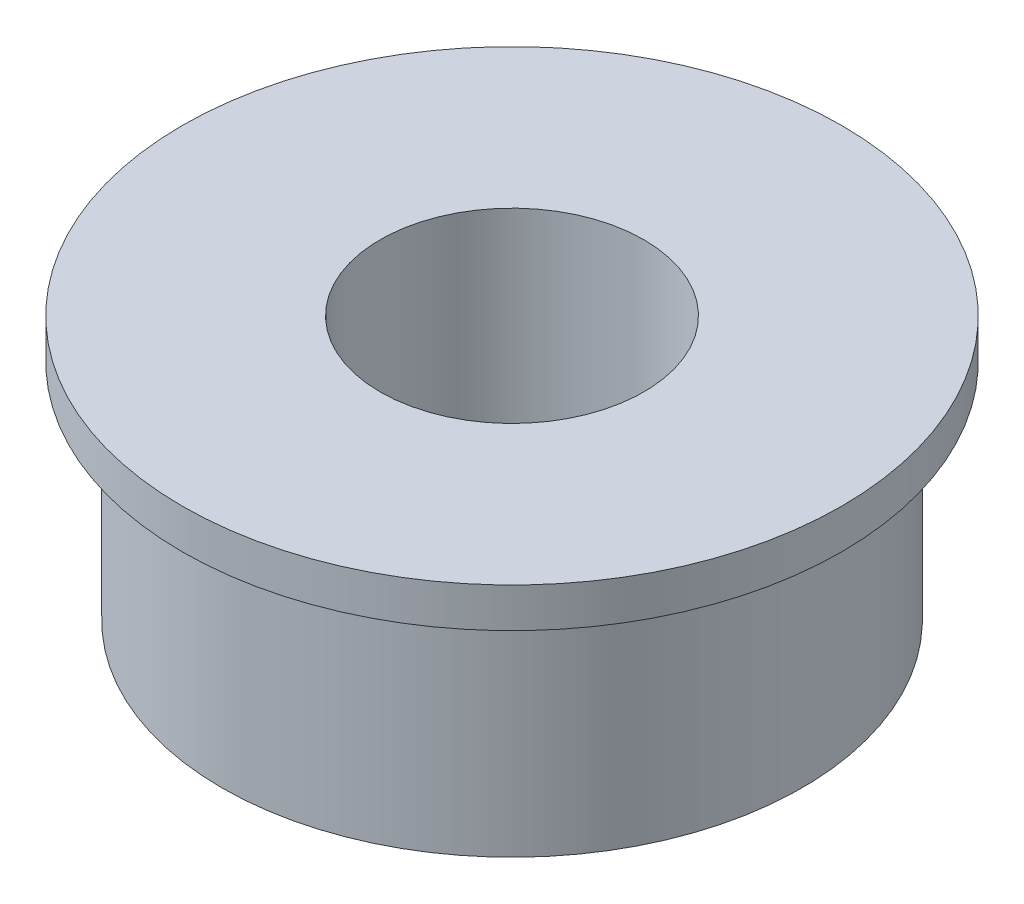
ISO-10303-21;
HEADER;
FILE_DESCRIPTION(('STEP AP214'),'2;1');
FILE_NAME('part.step','',(''),(''),'','','');
FILE_SCHEMA(('AUTOMOTIVE_DESIGN { 1 0 10303 214 1 1 1 1 }'));
ENDSEC;
DATA;
#1=APPLICATION_CONTEXT('core data for automotive mechanical design processes');
#2=APPLICATION_PROTOCOL_DEFINITION('international standard','automotive_design',2000,#1);
#3=PRODUCT_CONTEXT('',#1,'mechanical');
#4=PRODUCT('Part','Part','',(#3));
#5=PRODUCT_RELATED_PRODUCT_CATEGORY('part','',(#4));
#6=PRODUCT_DEFINITION_FORMATION('','',#4);
#7=PRODUCT_DEFINITION_CONTEXT('part definition',#1,'design');
#8=PRODUCT_DEFINITION('design','',#6,#7);
#9=PRODUCT_DEFINITION_SHAPE('','',#8);
#10=(LENGTH_UNIT() NAMED_UNIT(*) SI_UNIT(.MILLI.,.METRE.));
#11=(NAMED_UNIT(*) PLANE_ANGLE_UNIT() SI_UNIT($,.RADIAN.));
#12=(NAMED_UNIT(*) SI_UNIT($,.STERADIAN.) SOLID_ANGLE_UNIT());
#13=UNCERTAINTY_MEASURE_WITH_UNIT(LENGTH_MEASURE(1.E-05),#10,'distance_accuracy_value','');
#14=(GEOMETRIC_REPRESENTATION_CONTEXT(3) GLOBAL_UNCERTAINTY_ASSIGNED_CONTEXT((#13)) GLOBAL_UNIT_ASSIGNED_CONTEXT((#10,
#11,#12)) REPRESENTATION_CONTEXT('',''));
#15=CARTESIAN_POINT('',(0.,0.,0.));
#16=DIRECTION('',(0.,0.,1.));
#17=DIRECTION('',(1.,0.,0.));
#18=AXIS2_PLACEMENT_3D('',#15,#16,#17);
#19=CARTESIAN_POINT('',(0.,5.75520833333333,0.));
#20=DIRECTION('',(0.,1.,0.));
#21=DIRECTION('',(0.,0.,1.));
#22=AXIS2_PLACEMENT_3D('',#19,#20,#21);
#23=CYLINDRICAL_SURFACE('',#22,2.5);
#24=CARTESIAN_POINT('',(0.,5.,0.));
#25=DIRECTION('',(0.,1.,0.));
#26=DIRECTION('',(0.,0.,1.));
#27=AXIS2_PLACEMENT_3D('',#24,#25,#26);
#28=CIRCLE('',#27,2.5);
#29=CARTESIAN_POINT('',(0.,5.,2.5));
#30=VERTEX_POINT('',#29);
#31=EDGE_CURVE('E57',#30,#30,#28,.T.);
#32=ORIENTED_EDGE('',*,*,#31,.T.);
#33=EDGE_LOOP('',(#32));
#34=FACE_BOUND('',#33,.T.);
#35=CARTESIAN_POINT('',(0.,0.,0.));
#36=DIRECTION('',(0.,1.,0.));
#37=DIRECTION('',(0.,0.,1.));
#38=AXIS2_PLACEMENT_3D('',#35,#36,#37);
#39=CIRCLE('',#38,2.5);
#40=CARTESIAN_POINT('',(0.,0.,2.5));
#41=VERTEX_POINT('',#40);
#42=EDGE_CURVE('E10',#41,#41,#39,.T.);
#43=ORIENTED_EDGE('',*,*,#42,.F.);
#44=EDGE_LOOP('',(#43));
#45=FACE_BOUND('',#44,.T.);
#46=ADVANCED_FACE('F35',(#34,#45),#23,.F.);
#47=CARTESIAN_POINT('',(-2.5,0.,0.));
#48=DIRECTION('',(0.,-1.,0.));
#49=DIRECTION('',(0.,0.,-1.));
#50=AXIS2_PLACEMENT_3D('',#47,#48,#49);
#51=PLANE('',#50);
#52=ORIENTED_EDGE('',*,*,#42,.T.);
#53=EDGE_LOOP('',(#52));
#54=FACE_BOUND('',#53,.T.);
#55=CARTESIAN_POINT('',(0.,0.,0.));
#56=DIRECTION('',(0.,1.,0.));
#57=DIRECTION('',(0.,0.,1.));
#58=AXIS2_PLACEMENT_3D('',#55,#56,#57);
#59=CIRCLE('',#58,5.5);
#60=CARTESIAN_POINT('',(0.,0.,5.5));
#61=VERTEX_POINT('',#60);
#62=EDGE_CURVE('E41',#61,#61,#59,.T.);
#63=ORIENTED_EDGE('',*,*,#62,.F.);
#64=EDGE_LOOP('',(#63));
#65=FACE_BOUND('',#64,.T.);
#66=ADVANCED_FACE('F75',(#54,#65),#51,.T.);
#67=CARTESIAN_POINT('',(0.,5.75520833333333,0.));
#68=DIRECTION('',(0.,1.,0.));
#69=DIRECTION('',(0.,0.,1.));
#70=AXIS2_PLACEMENT_3D('',#67,#68,#69);
#71=CYLINDRICAL_SURFACE('',#70,5.5);
#72=ORIENTED_EDGE('',*,*,#62,.T.);
#73=EDGE_LOOP('',(#72));
#74=FACE_BOUND('',#73,.T.);
#75=CARTESIAN_POINT('',(0.,4.25,0.));
#76=DIRECTION('',(0.,1.,0.));
#77=DIRECTION('',(0.,0.,1.));
#78=AXIS2_PLACEMENT_3D('',#75,#76,#77);
#79=CIRCLE('',#78,5.5);
#80=CARTESIAN_POINT('',(0.,4.25,5.5));
#81=VERTEX_POINT('',#80);
#82=EDGE_CURVE('E45',#81,#81,#79,.T.);
#83=ORIENTED_EDGE('',*,*,#82,.F.);
#84=EDGE_LOOP('',(#83));
#85=FACE_BOUND('',#84,.T.);
#86=ADVANCED_FACE('F79',(#74,#85),#71,.T.);
#87=CARTESIAN_POINT('',(-5.5,4.25,0.));
#88=DIRECTION('',(0.,-1.,0.));
#89=DIRECTION('',(0.,0.,-1.));
#90=AXIS2_PLACEMENT_3D('',#87,#88,#89);
#91=PLANE('',#90);
#92=ORIENTED_EDGE('',*,*,#82,.T.);
#93=EDGE_LOOP('',(#92));
#94=FACE_BOUND('',#93,.T.);
#95=CARTESIAN_POINT('',(0.,4.25,0.));
#96=DIRECTION('',(0.,1.,0.));
#97=DIRECTION('',(0.,0.,1.));
#98=AXIS2_PLACEMENT_3D('',#95,#96,#97);
#99=CIRCLE('',#98,6.25);
#100=CARTESIAN_POINT('',(0.,4.25,6.25));
#101=VERTEX_POINT('',#100);
#102=EDGE_CURVE('E49',#101,#101,#99,.T.);
#103=ORIENTED_EDGE('',*,*,#102,.F.);
#104=EDGE_LOOP('',(#103));
#105=FACE_BOUND('',#104,.T.);
#106=ADVANCED_FACE('F71',(#94,#105),#91,.T.);
#107=CARTESIAN_POINT('',(0.,5.75520833333333,0.));
#108=DIRECTION('',(0.,1.,0.));
#109=DIRECTION('',(0.,0.,1.));
#110=AXIS2_PLACEMENT_3D('',#107,#108,#109);
#111=CYLINDRICAL_SURFACE('',#110,6.25);
#112=ORIENTED_EDGE('',*,*,#102,.T.);
#113=EDGE_LOOP('',(#112));
#114=FACE_BOUND('',#113,.T.);
#115=CARTESIAN_POINT('',(0.,5.,0.));
#116=DIRECTION('',(0.,1.,0.));
#117=DIRECTION('',(0.,0.,1.));
#118=AXIS2_PLACEMENT_3D('',#115,#116,#117);
#119=CIRCLE('',#118,6.25);
#120=CARTESIAN_POINT('',(0.,5.,6.25));
#121=VERTEX_POINT('',#120);
#122=EDGE_CURVE('E54',#121,#121,#119,.T.);
#123=ORIENTED_EDGE('',*,*,#122,.F.);
#124=EDGE_LOOP('',(#123));
#125=FACE_BOUND('',#124,.T.);
#126=ADVANCED_FACE('F65',(#114,#125),#111,.T.);
#127=CARTESIAN_POINT('',(-6.25,5.,0.));
#128=DIRECTION('',(0.,1.,0.));
#129=DIRECTION('',(0.,0.,1.));
#130=AXIS2_PLACEMENT_3D('',#127,#128,#129);
#131=PLANE('',#130);
#132=ORIENTED_EDGE('',*,*,#122,.T.);
#133=EDGE_LOOP('',(#132));
#134=FACE_BOUND('',#133,.T.);
#135=ORIENTED_EDGE('',*,*,#31,.F.);
#136=EDGE_LOOP('',(#135));
#137=FACE_BOUND('',#136,.T.);
#138=ADVANCED_FACE('F63',(#134,#137),#131,.T.);
#139=CLOSED_SHELL('',(#46,#66,#86,#106,#126,#138));
#140=MANIFOLD_SOLID_BREP('B2',#139);
#141=ADVANCED_BREP_SHAPE_REPRESENTATION('',(#18,#140),#14);
#142=SHAPE_DEFINITION_REPRESENTATION(#9,#141);
ENDSEC;
END-ISO-10303-21;
